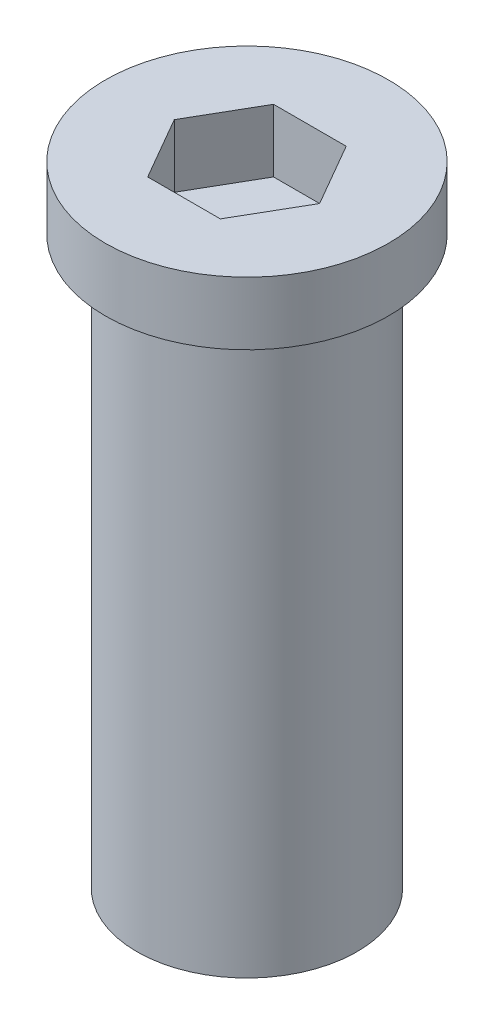
ISO-10303-21;
HEADER;
FILE_DESCRIPTION(('STEP AP214'),'2;1');
FILE_NAME('part.step','',(''),(''),'','','');
FILE_SCHEMA(('AUTOMOTIVE_DESIGN { 1 0 10303 214 1 1 1 1 }'));
ENDSEC;
DATA;
#1=APPLICATION_CONTEXT('core data for automotive mechanical design processes');
#2=APPLICATION_PROTOCOL_DEFINITION('international standard','automotive_design',2000,#1);
#3=PRODUCT_CONTEXT('',#1,'mechanical');
#4=PRODUCT('Part','Part','',(#3));
#5=PRODUCT_RELATED_PRODUCT_CATEGORY('part','',(#4));
#6=PRODUCT_DEFINITION_FORMATION('','',#4);
#7=PRODUCT_DEFINITION_CONTEXT('part definition',#1,'design');
#8=PRODUCT_DEFINITION('design','',#6,#7);
#9=PRODUCT_DEFINITION_SHAPE('','',#8);
#10=(LENGTH_UNIT() NAMED_UNIT(*) SI_UNIT(.MILLI.,.METRE.));
#11=(NAMED_UNIT(*) PLANE_ANGLE_UNIT() SI_UNIT($,.RADIAN.));
#12=(NAMED_UNIT(*) SI_UNIT($,.STERADIAN.) SOLID_ANGLE_UNIT());
#13=UNCERTAINTY_MEASURE_WITH_UNIT(LENGTH_MEASURE(1.E-05),#10,'distance_accuracy_value','');
#14=(GEOMETRIC_REPRESENTATION_CONTEXT(3) GLOBAL_UNCERTAINTY_ASSIGNED_CONTEXT((#13)) GLOBAL_UNIT_ASSIGNED_CONTEXT((#10,
#11,#12)) REPRESENTATION_CONTEXT('',''));
#15=CARTESIAN_POINT('',(0.,0.,0.));
#16=DIRECTION('',(0.,0.,1.));
#17=DIRECTION('',(1.,0.,0.));
#18=AXIS2_PLACEMENT_3D('',#15,#16,#17);
#19=CARTESIAN_POINT('',(0.,4.5,0.));
#20=DIRECTION('',(0.,-1.,0.));
#21=DIRECTION('',(0.,0.,-1.));
#22=AXIS2_PLACEMENT_3D('',#19,#20,#21);
#23=CYLINDRICAL_SURFACE('',#22,1.75);
#24=CARTESIAN_POINT('',(0.,4.5,0.));
#25=DIRECTION('',(0.,1.,0.));
#26=DIRECTION('',(0.,0.,1.));
#27=AXIS2_PLACEMENT_3D('',#24,#25,#26);
#28=CIRCLE('',#27,1.75);
#29=CARTESIAN_POINT('',(0.,4.5,1.75));
#30=VERTEX_POINT('',#29);
#31=EDGE_CURVE('E11',#30,#30,#28,.T.);
#32=ORIENTED_EDGE('',*,*,#31,.F.);
#33=EDGE_LOOP('',(#32));
#34=FACE_BOUND('',#33,.T.);
#35=CARTESIAN_POINT('',(0.,-4.5,0.));
#36=DIRECTION('',(0.,1.,0.));
#37=DIRECTION('',(0.,0.,1.));
#38=AXIS2_PLACEMENT_3D('',#35,#36,#37);
#39=CIRCLE('',#38,1.75);
#40=CARTESIAN_POINT('',(0.,-4.5,1.75));
#41=VERTEX_POINT('',#40);
#42=EDGE_CURVE('E44',#41,#41,#39,.T.);
#43=ORIENTED_EDGE('',*,*,#42,.T.);
#44=EDGE_LOOP('',(#43));
#45=FACE_BOUND('',#44,.T.);
#46=ADVANCED_FACE('F41',(#34,#45),#23,.T.);
#47=CARTESIAN_POINT('',(0.,-4.5,0.));
#48=DIRECTION('',(0.,1.,0.));
#49=DIRECTION('',(0.,0.,1.));
#50=AXIS2_PLACEMENT_3D('',#47,#48,#49);
#51=PLANE('',#50);
#52=ORIENTED_EDGE('',*,*,#42,.F.);
#53=EDGE_LOOP('',(#52));
#54=FACE_BOUND('',#53,.T.);
#55=ADVANCED_FACE('F173',(#54),#51,.F.);
#56=CARTESIAN_POINT('',(0.,5.5,0.));
#57=DIRECTION('',(0.,-1.,0.));
#58=DIRECTION('',(0.,0.,-1.));
#59=AXIS2_PLACEMENT_3D('',#56,#57,#58);
#60=CYLINDRICAL_SURFACE('',#59,2.25);
#61=CARTESIAN_POINT('',(0.,5.5,0.));
#62=DIRECTION('',(0.,1.,0.));
#63=DIRECTION('',(0.,0.,1.));
#64=AXIS2_PLACEMENT_3D('',#61,#62,#63);
#65=CIRCLE('',#64,2.25);
#66=CARTESIAN_POINT('',(0.,5.5,2.25));
#67=VERTEX_POINT('',#66);
#68=EDGE_CURVE('E148',#67,#67,#65,.T.);
#69=ORIENTED_EDGE('',*,*,#68,.F.);
#70=EDGE_LOOP('',(#69));
#71=FACE_BOUND('',#70,.T.);
#72=CARTESIAN_POINT('',(0.,4.5,0.));
#73=DIRECTION('',(0.,1.,0.));
#74=DIRECTION('',(0.,0.,1.));
#75=AXIS2_PLACEMENT_3D('',#72,#73,#74);
#76=CIRCLE('',#75,2.25);
#77=CARTESIAN_POINT('',(0.,4.5,2.25));
#78=VERTEX_POINT('',#77);
#79=EDGE_CURVE('E142',#78,#78,#76,.T.);
#80=ORIENTED_EDGE('',*,*,#79,.T.);
#81=EDGE_LOOP('',(#80));
#82=FACE_BOUND('',#81,.T.);
#83=ADVANCED_FACE('F154',(#71,#82),#60,.T.);
#84=CARTESIAN_POINT('',(0.,5.5,0.));
#85=DIRECTION('',(0.,1.,0.));
#86=DIRECTION('',(0.,0.,1.));
#87=AXIS2_PLACEMENT_3D('',#84,#85,#86);
#88=PLANE('',#87);
#89=DIRECTION('',(0.5,0.,-0.866025403784439));
#90=VECTOR('',#89,1.);
#91=CARTESIAN_POINT('',(0.577350269189625,5.5,1.));
#92=LINE('',#91,#90);
#93=CARTESIAN_POINT('',(0.577350269189625,5.5,1.));
#94=VERTEX_POINT('',#93);
#95=CARTESIAN_POINT('',(1.15470053837925,5.5,0.));
#96=VERTEX_POINT('',#95);
#97=EDGE_CURVE('E55',#94,#96,#92,.T.);
#98=ORIENTED_EDGE('',*,*,#97,.F.);
#99=DIRECTION('',(1.,0.,0.));
#100=VECTOR('',#99,1.);
#101=CARTESIAN_POINT('',(-0.577350269189626,5.5,1.));
#102=LINE('',#101,#100);
#103=CARTESIAN_POINT('',(-0.577350269189626,5.5,1.));
#104=VERTEX_POINT('',#103);
#105=EDGE_CURVE('E138',#104,#94,#102,.T.);
#106=ORIENTED_EDGE('',*,*,#105,.F.);
#107=DIRECTION('',(0.5,0.,0.866025403784439));
#108=VECTOR('',#107,1.);
#109=CARTESIAN_POINT('',(-1.15470053837925,5.5,0.));
#110=LINE('',#109,#108);
#111=CARTESIAN_POINT('',(-1.15470053837925,5.5,0.));
#112=VERTEX_POINT('',#111);
#113=EDGE_CURVE('E136',#112,#104,#110,.T.);
#114=ORIENTED_EDGE('',*,*,#113,.F.);
#115=DIRECTION('',(-0.5,0.,0.866025403784439));
#116=VECTOR('',#115,1.);
#117=CARTESIAN_POINT('',(-0.577350269189626,5.5,-1.));
#118=LINE('',#117,#116);
#119=CARTESIAN_POINT('',(-0.577350269189626,5.5,-1.));
#120=VERTEX_POINT('',#119);
#121=EDGE_CURVE('E103',#120,#112,#118,.T.);
#122=ORIENTED_EDGE('',*,*,#121,.F.);
#123=DIRECTION('',(-1.,0.,0.));
#124=VECTOR('',#123,1.);
#125=CARTESIAN_POINT('',(0.577350269189626,5.5,-1.));
#126=LINE('',#125,#124);
#127=CARTESIAN_POINT('',(0.577350269189626,5.5,-1.));
#128=VERTEX_POINT('',#127);
#129=EDGE_CURVE('E132',#128,#120,#126,.T.);
#130=ORIENTED_EDGE('',*,*,#129,.F.);
#131=DIRECTION('',(-0.5,0.,-0.866025403784439));
#132=VECTOR('',#131,1.);
#133=CARTESIAN_POINT('',(1.15470053837925,5.5,0.));
#134=LINE('',#133,#132);
#135=EDGE_CURVE('E129',#96,#128,#134,.T.);
#136=ORIENTED_EDGE('',*,*,#135,.F.);
#137=EDGE_LOOP('',(#98,#106,#114,#122,#130,#136));
#138=FACE_BOUND('',#137,.T.);
#139=ORIENTED_EDGE('',*,*,#68,.T.);
#140=EDGE_LOOP('',(#139));
#141=FACE_BOUND('',#140,.T.);
#142=ADVANCED_FACE('F159',(#138,#141),#88,.T.);
#143=CARTESIAN_POINT('',(0.,4.5,0.));
#144=DIRECTION('',(0.,1.,0.));
#145=DIRECTION('',(0.,0.,1.));
#146=AXIS2_PLACEMENT_3D('',#143,#144,#145);
#147=PLANE('',#146);
#148=ORIENTED_EDGE('',*,*,#31,.T.);
#149=EDGE_LOOP('',(#148));
#150=FACE_BOUND('',#149,.T.);
#151=ORIENTED_EDGE('',*,*,#79,.F.);
#152=EDGE_LOOP('',(#151));
#153=FACE_BOUND('',#152,.T.);
#154=ADVANCED_FACE('F156',(#150,#153),#147,.F.);
#155=CARTESIAN_POINT('',(0.577350269189625,4.5,1.));
#156=DIRECTION('',(0.866025403784439,0.,0.5));
#157=DIRECTION('',(0.5,0.,-0.866025403784439));
#158=AXIS2_PLACEMENT_3D('',#155,#156,#157);
#159=PLANE('',#158);
#160=ORIENTED_EDGE('',*,*,#97,.T.);
#161=DIRECTION('',(0.,1.,0.));
#162=VECTOR('',#161,1.);
#163=CARTESIAN_POINT('',(1.15470053837925,4.5,0.));
#164=LINE('',#163,#162);
#165=CARTESIAN_POINT('',(1.15470053837925,4.5,0.));
#166=VERTEX_POINT('',#165);
#167=EDGE_CURVE('E85',#166,#96,#164,.T.);
#168=ORIENTED_EDGE('',*,*,#167,.F.);
#169=DIRECTION('',(0.5,0.,-0.866025403784439));
#170=VECTOR('',#169,1.);
#171=CARTESIAN_POINT('',(0.577350269189625,4.5,1.));
#172=LINE('',#171,#170);
#173=CARTESIAN_POINT('',(0.577350269189625,4.5,1.));
#174=VERTEX_POINT('',#173);
#175=EDGE_CURVE('E140',#174,#166,#172,.T.);
#176=ORIENTED_EDGE('',*,*,#175,.F.);
#177=DIRECTION('',(0.,1.,0.));
#178=VECTOR('',#177,1.);
#179=CARTESIAN_POINT('',(0.577350269189625,4.5,1.));
#180=LINE('',#179,#178);
#181=EDGE_CURVE('E63',#174,#94,#180,.T.);
#182=ORIENTED_EDGE('',*,*,#181,.T.);
#183=EDGE_LOOP('',(#160,#168,#176,#182));
#184=FACE_BOUND('',#183,.T.);
#185=ADVANCED_FACE('F158',(#184),#159,.F.);
#186=CARTESIAN_POINT('',(-0.577350269189626,4.5,1.));
#187=DIRECTION('',(0.,0.,1.));
#188=DIRECTION('',(1.,0.,0.));
#189=AXIS2_PLACEMENT_3D('',#186,#187,#188);
#190=PLANE('',#189);
#191=ORIENTED_EDGE('',*,*,#105,.T.);
#192=ORIENTED_EDGE('',*,*,#181,.F.);
#193=DIRECTION('',(1.,0.,0.));
#194=VECTOR('',#193,1.);
#195=CARTESIAN_POINT('',(-0.577350269189626,4.5,1.));
#196=LINE('',#195,#194);
#197=CARTESIAN_POINT('',(-0.577350269189626,4.5,1.));
#198=VERTEX_POINT('',#197);
#199=EDGE_CURVE('E115',#198,#174,#196,.T.);
#200=ORIENTED_EDGE('',*,*,#199,.F.);
#201=DIRECTION('',(0.,1.,0.));
#202=VECTOR('',#201,1.);
#203=CARTESIAN_POINT('',(-0.577350269189626,4.5,1.));
#204=LINE('',#203,#202);
#205=EDGE_CURVE('E107',#198,#104,#204,.T.);
#206=ORIENTED_EDGE('',*,*,#205,.T.);
#207=EDGE_LOOP('',(#191,#192,#200,#206));
#208=FACE_BOUND('',#207,.T.);
#209=ADVANCED_FACE('F167',(#208),#190,.F.);
#210=CARTESIAN_POINT('',(-1.15470053837925,4.5,0.));
#211=DIRECTION('',(-0.866025403784439,0.,0.5));
#212=DIRECTION('',(0.5,0.,0.866025403784439));
#213=AXIS2_PLACEMENT_3D('',#210,#211,#212);
#214=PLANE('',#213);
#215=ORIENTED_EDGE('',*,*,#113,.T.);
#216=ORIENTED_EDGE('',*,*,#205,.F.);
#217=DIRECTION('',(0.5,0.,0.866025403784439));
#218=VECTOR('',#217,1.);
#219=CARTESIAN_POINT('',(-1.15470053837925,4.5,0.));
#220=LINE('',#219,#218);
#221=CARTESIAN_POINT('',(-1.15470053837925,4.5,0.));
#222=VERTEX_POINT('',#221);
#223=EDGE_CURVE('E111',#222,#198,#220,.T.);
#224=ORIENTED_EDGE('',*,*,#223,.F.);
#225=DIRECTION('',(0.,1.,0.));
#226=VECTOR('',#225,1.);
#227=CARTESIAN_POINT('',(-1.15470053837925,4.5,0.));
#228=LINE('',#227,#226);
#229=EDGE_CURVE('E96',#222,#112,#228,.T.);
#230=ORIENTED_EDGE('',*,*,#229,.T.);
#231=EDGE_LOOP('',(#215,#216,#224,#230));
#232=FACE_BOUND('',#231,.T.);
#233=ADVANCED_FACE('F112',(#232),#214,.F.);
#234=CARTESIAN_POINT('',(-0.577350269189626,4.5,-1.));
#235=DIRECTION('',(-0.866025403784439,0.,-0.5));
#236=DIRECTION('',(-0.5,0.,0.866025403784439));
#237=AXIS2_PLACEMENT_3D('',#234,#235,#236);
#238=PLANE('',#237);
#239=ORIENTED_EDGE('',*,*,#121,.T.);
#240=ORIENTED_EDGE('',*,*,#229,.F.);
#241=DIRECTION('',(-0.5,0.,0.866025403784439));
#242=VECTOR('',#241,1.);
#243=CARTESIAN_POINT('',(-0.577350269189626,4.5,-1.));
#244=LINE('',#243,#242);
#245=CARTESIAN_POINT('',(-0.577350269189626,4.5,-1.));
#246=VERTEX_POINT('',#245);
#247=EDGE_CURVE('E100',#246,#222,#244,.T.);
#248=ORIENTED_EDGE('',*,*,#247,.F.);
#249=DIRECTION('',(0.,1.,0.));
#250=VECTOR('',#249,1.);
#251=CARTESIAN_POINT('',(-0.577350269189626,4.5,-1.));
#252=LINE('',#251,#250);
#253=EDGE_CURVE('E108',#246,#120,#252,.T.);
#254=ORIENTED_EDGE('',*,*,#253,.T.);
#255=EDGE_LOOP('',(#239,#240,#248,#254));
#256=FACE_BOUND('',#255,.T.);
#257=ADVANCED_FACE('F98',(#256),#238,.F.);
#258=CARTESIAN_POINT('',(0.577350269189626,4.5,-1.));
#259=DIRECTION('',(0.,0.,-1.));
#260=DIRECTION('',(-1.,0.,0.));
#261=AXIS2_PLACEMENT_3D('',#258,#259,#260);
#262=PLANE('',#261);
#263=ORIENTED_EDGE('',*,*,#129,.T.);
#264=ORIENTED_EDGE('',*,*,#253,.F.);
#265=DIRECTION('',(-1.,0.,0.));
#266=VECTOR('',#265,1.);
#267=CARTESIAN_POINT('',(0.577350269189626,4.5,-1.));
#268=LINE('',#267,#266);
#269=CARTESIAN_POINT('',(0.577350269189626,4.5,-1.));
#270=VERTEX_POINT('',#269);
#271=EDGE_CURVE('E121',#270,#246,#268,.T.);
#272=ORIENTED_EDGE('',*,*,#271,.F.);
#273=DIRECTION('',(0.,1.,0.));
#274=VECTOR('',#273,1.);
#275=CARTESIAN_POINT('',(0.577350269189626,4.5,-1.));
#276=LINE('',#275,#274);
#277=EDGE_CURVE('E145',#270,#128,#276,.T.);
#278=ORIENTED_EDGE('',*,*,#277,.T.);
#279=EDGE_LOOP('',(#263,#264,#272,#278));
#280=FACE_BOUND('',#279,.T.);
#281=ADVANCED_FACE('F235',(#280),#262,.F.);
#282=CARTESIAN_POINT('',(1.15470053837925,4.5,0.));
#283=DIRECTION('',(0.866025403784439,0.,-0.5));
#284=DIRECTION('',(-0.5,0.,-0.866025403784439));
#285=AXIS2_PLACEMENT_3D('',#282,#283,#284);
#286=PLANE('',#285);
#287=ORIENTED_EDGE('',*,*,#135,.T.);
#288=ORIENTED_EDGE('',*,*,#277,.F.);
#289=DIRECTION('',(-0.5,0.,-0.866025403784439));
#290=VECTOR('',#289,1.);
#291=CARTESIAN_POINT('',(1.15470053837925,4.5,0.));
#292=LINE('',#291,#290);
#293=EDGE_CURVE('E123',#166,#270,#292,.T.);
#294=ORIENTED_EDGE('',*,*,#293,.F.);
#295=ORIENTED_EDGE('',*,*,#167,.T.);
#296=EDGE_LOOP('',(#287,#288,#294,#295));
#297=FACE_BOUND('',#296,.T.);
#298=ADVANCED_FACE('F244',(#297),#286,.F.);
#299=CARTESIAN_POINT('',(0.,4.5,0.));
#300=DIRECTION('',(0.,1.,0.));
#301=DIRECTION('',(0.,0.,1.));
#302=AXIS2_PLACEMENT_3D('',#299,#300,#301);
#303=PLANE('',#302);
#304=ORIENTED_EDGE('',*,*,#175,.T.);
#305=ORIENTED_EDGE('',*,*,#293,.T.);
#306=ORIENTED_EDGE('',*,*,#271,.T.);
#307=ORIENTED_EDGE('',*,*,#247,.T.);
#308=ORIENTED_EDGE('',*,*,#223,.T.);
#309=ORIENTED_EDGE('',*,*,#199,.T.);
#310=EDGE_LOOP('',(#304,#305,#306,#307,#308,#309));
#311=FACE_BOUND('',#310,.T.);
#312=ADVANCED_FACE('F118',(#311),#303,.T.);
#313=CLOSED_SHELL('',(#46,#55,#83,#142,#154,#185,#209,#233,#257,#281,#298,#312));
#314=MANIFOLD_SOLID_BREP('B2',#313);
#315=ADVANCED_BREP_SHAPE_REPRESENTATION('',(#18,#314),#14);
#316=SHAPE_DEFINITION_REPRESENTATION(#9,#315);
ENDSEC;
END-ISO-10303-21;
